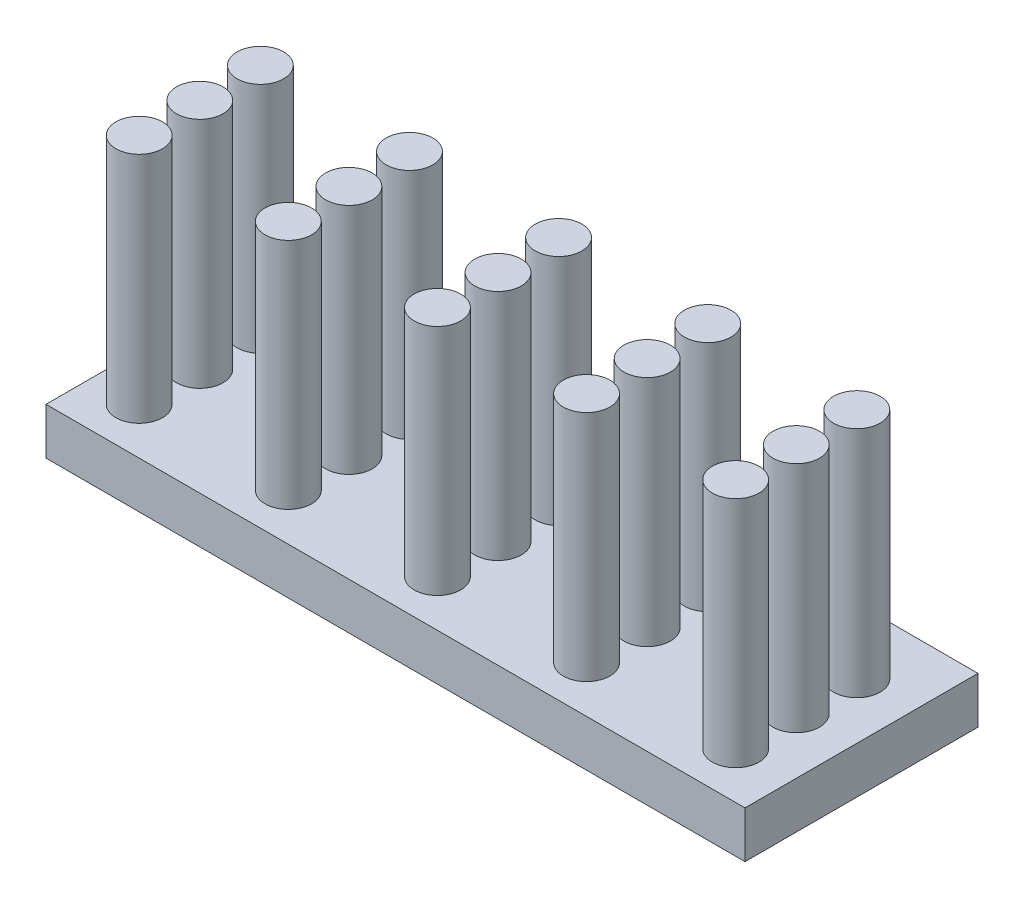
ISO-10303-21;
HEADER;
FILE_DESCRIPTION(('STEP AP214'),'2;1');
FILE_NAME('part.step','',(''),(''),'','','');
FILE_SCHEMA(('AUTOMOTIVE_DESIGN { 1 0 10303 214 1 1 1 1 }'));
ENDSEC;
DATA;
#1=APPLICATION_CONTEXT('core data for automotive mechanical design processes');
#2=APPLICATION_PROTOCOL_DEFINITION('international standard','automotive_design',2000,#1);
#3=PRODUCT_CONTEXT('',#1,'mechanical');
#4=PRODUCT('Part','Part','',(#3));
#5=PRODUCT_RELATED_PRODUCT_CATEGORY('part','',(#4));
#6=PRODUCT_DEFINITION_FORMATION('','',#4);
#7=PRODUCT_DEFINITION_CONTEXT('part definition',#1,'design');
#8=PRODUCT_DEFINITION('design','',#6,#7);
#9=PRODUCT_DEFINITION_SHAPE('','',#8);
#10=(LENGTH_UNIT() NAMED_UNIT(*) SI_UNIT(.MILLI.,.METRE.));
#11=(NAMED_UNIT(*) PLANE_ANGLE_UNIT() SI_UNIT($,.RADIAN.));
#12=(NAMED_UNIT(*) SI_UNIT($,.STERADIAN.) SOLID_ANGLE_UNIT());
#13=UNCERTAINTY_MEASURE_WITH_UNIT(LENGTH_MEASURE(1.E-05),#10,'distance_accuracy_value','');
#14=(GEOMETRIC_REPRESENTATION_CONTEXT(3) GLOBAL_UNCERTAINTY_ASSIGNED_CONTEXT((#13)) GLOBAL_UNIT_ASSIGNED_CONTEXT((#10,
#11,#12)) REPRESENTATION_CONTEXT('',''));
#15=CARTESIAN_POINT('',(0.,0.,0.));
#16=DIRECTION('',(0.,0.,1.));
#17=DIRECTION('',(1.,0.,0.));
#18=AXIS2_PLACEMENT_3D('',#15,#16,#17);
#19=CARTESIAN_POINT('',(63.,60.,-11.));
#20=DIRECTION('',(0.,1.,0.));
#21=DIRECTION('',(0.,0.,1.));
#22=AXIS2_PLACEMENT_3D('',#19,#20,#21);
#23=PLANE('',#22);
#24=CARTESIAN_POINT('',(63.,60.,-11.));
#25=DIRECTION('',(0.,1.,0.));
#26=DIRECTION('',(0.,0.,1.));
#27=AXIS2_PLACEMENT_3D('',#24,#25,#26);
#28=CIRCLE('',#27,5.);
#29=CARTESIAN_POINT('',(63.,60.,-6.));
#30=VERTEX_POINT('',#29);
#31=EDGE_CURVE('E11',#30,#30,#28,.T.);
#32=ORIENTED_EDGE('',*,*,#31,.T.);
#33=EDGE_LOOP('',(#32));
#34=FACE_BOUND('',#33,.T.);
#35=ADVANCED_FACE('F38',(#34),#23,.T.);
#36=CARTESIAN_POINT('',(63.,60.,-11.));
#37=DIRECTION('',(0.,-1.,0.));
#38=DIRECTION('',(0.,0.,-1.));
#39=AXIS2_PLACEMENT_3D('',#36,#37,#38);
#40=CYLINDRICAL_SURFACE('',#39,5.);
#41=ORIENTED_EDGE('',*,*,#31,.F.);
#42=EDGE_LOOP('',(#41));
#43=FACE_BOUND('',#42,.T.);
#44=CARTESIAN_POINT('',(63.,10.,-11.));
#45=DIRECTION('',(0.,1.,0.));
#46=DIRECTION('',(0.,0.,1.));
#47=AXIS2_PLACEMENT_3D('',#44,#45,#46);
#48=CIRCLE('',#47,5.);
#49=CARTESIAN_POINT('',(63.,10.,-6.));
#50=VERTEX_POINT('',#49);
#51=EDGE_CURVE('E47',#50,#50,#48,.T.);
#52=ORIENTED_EDGE('',*,*,#51,.T.);
#53=EDGE_LOOP('',(#52));
#54=FACE_BOUND('',#53,.T.);
#55=ADVANCED_FACE('F227',(#43,#54),#40,.T.);
#56=CARTESIAN_POINT('',(31.,60.,-11.));
#57=DIRECTION('',(0.,1.,0.));
#58=DIRECTION('',(0.,0.,1.));
#59=AXIS2_PLACEMENT_3D('',#56,#57,#58);
#60=PLANE('',#59);
#61=CARTESIAN_POINT('',(31.,60.,-11.));
#62=DIRECTION('',(0.,1.,0.));
#63=DIRECTION('',(0.,0.,1.));
#64=AXIS2_PLACEMENT_3D('',#61,#62,#63);
#65=CIRCLE('',#64,5.);
#66=CARTESIAN_POINT('',(31.,60.,-6.));
#67=VERTEX_POINT('',#66);
#68=EDGE_CURVE('E220',#67,#67,#65,.T.);
#69=ORIENTED_EDGE('',*,*,#68,.T.);
#70=EDGE_LOOP('',(#69));
#71=FACE_BOUND('',#70,.T.);
#72=ADVANCED_FACE('F253',(#71),#60,.T.);
#73=CARTESIAN_POINT('',(31.,60.,-11.));
#74=DIRECTION('',(0.,-1.,0.));
#75=DIRECTION('',(0.,0.,-1.));
#76=AXIS2_PLACEMENT_3D('',#73,#74,#75);
#77=CYLINDRICAL_SURFACE('',#76,5.);
#78=ORIENTED_EDGE('',*,*,#68,.F.);
#79=EDGE_LOOP('',(#78));
#80=FACE_BOUND('',#79,.T.);
#81=CARTESIAN_POINT('',(31.,10.,-11.));
#82=DIRECTION('',(0.,1.,0.));
#83=DIRECTION('',(0.,0.,1.));
#84=AXIS2_PLACEMENT_3D('',#81,#82,#83);
#85=CIRCLE('',#84,5.);
#86=CARTESIAN_POINT('',(31.,10.,-6.));
#87=VERTEX_POINT('',#86);
#88=EDGE_CURVE('E216',#87,#87,#85,.T.);
#89=ORIENTED_EDGE('',*,*,#88,.T.);
#90=EDGE_LOOP('',(#89));
#91=FACE_BOUND('',#90,.T.);
#92=ADVANCED_FACE('F259',(#80,#91),#77,.T.);
#93=CARTESIAN_POINT('',(-0.999999999999973,60.,-11.));
#94=DIRECTION('',(0.,1.,0.));
#95=DIRECTION('',(0.,0.,1.));
#96=AXIS2_PLACEMENT_3D('',#93,#94,#95);
#97=PLANE('',#96);
#98=CARTESIAN_POINT('',(-0.999999999999973,60.,-11.));
#99=DIRECTION('',(0.,1.,0.));
#100=DIRECTION('',(0.,0.,1.));
#101=AXIS2_PLACEMENT_3D('',#98,#99,#100);
#102=CIRCLE('',#101,5.);
#103=CARTESIAN_POINT('',(-0.999999999999973,60.,-6.));
#104=VERTEX_POINT('',#103);
#105=EDGE_CURVE('E212',#104,#104,#102,.T.);
#106=ORIENTED_EDGE('',*,*,#105,.T.);
#107=EDGE_LOOP('',(#106));
#108=FACE_BOUND('',#107,.T.);
#109=ADVANCED_FACE('F265',(#108),#97,.T.);
#110=CARTESIAN_POINT('',(-0.999999999999973,60.,-11.));
#111=DIRECTION('',(0.,-1.,0.));
#112=DIRECTION('',(0.,0.,-1.));
#113=AXIS2_PLACEMENT_3D('',#110,#111,#112);
#114=CYLINDRICAL_SURFACE('',#113,5.);
#115=ORIENTED_EDGE('',*,*,#105,.F.);
#116=EDGE_LOOP('',(#115));
#117=FACE_BOUND('',#116,.T.);
#118=CARTESIAN_POINT('',(-0.999999999999973,10.,-11.));
#119=DIRECTION('',(0.,1.,0.));
#120=DIRECTION('',(0.,0.,1.));
#121=AXIS2_PLACEMENT_3D('',#118,#119,#120);
#122=CIRCLE('',#121,5.);
#123=CARTESIAN_POINT('',(-0.999999999999973,10.,-6.));
#124=VERTEX_POINT('',#123);
#125=EDGE_CURVE('E208',#124,#124,#122,.T.);
#126=ORIENTED_EDGE('',*,*,#125,.T.);
#127=EDGE_LOOP('',(#126));
#128=FACE_BOUND('',#127,.T.);
#129=ADVANCED_FACE('F269',(#117,#128),#114,.T.);
#130=CARTESIAN_POINT('',(-33.,60.,-11.));
#131=DIRECTION('',(0.,1.,0.));
#132=DIRECTION('',(0.,0.,1.));
#133=AXIS2_PLACEMENT_3D('',#130,#131,#132);
#134=PLANE('',#133);
#135=CARTESIAN_POINT('',(-33.,60.,-11.));
#136=DIRECTION('',(0.,1.,0.));
#137=DIRECTION('',(0.,0.,1.));
#138=AXIS2_PLACEMENT_3D('',#135,#136,#137);
#139=CIRCLE('',#138,5.);
#140=CARTESIAN_POINT('',(-33.,60.,-6.));
#141=VERTEX_POINT('',#140);
#142=EDGE_CURVE('E204',#141,#141,#139,.T.);
#143=ORIENTED_EDGE('',*,*,#142,.T.);
#144=EDGE_LOOP('',(#143));
#145=FACE_BOUND('',#144,.T.);
#146=ADVANCED_FACE('F273',(#145),#134,.T.);
#147=CARTESIAN_POINT('',(-33.,60.,-11.));
#148=DIRECTION('',(0.,-1.,0.));
#149=DIRECTION('',(0.,0.,-1.));
#150=AXIS2_PLACEMENT_3D('',#147,#148,#149);
#151=CYLINDRICAL_SURFACE('',#150,5.);
#152=ORIENTED_EDGE('',*,*,#142,.F.);
#153=EDGE_LOOP('',(#152));
#154=FACE_BOUND('',#153,.T.);
#155=CARTESIAN_POINT('',(-33.,10.,-11.));
#156=DIRECTION('',(0.,1.,0.));
#157=DIRECTION('',(0.,0.,1.));
#158=AXIS2_PLACEMENT_3D('',#155,#156,#157);
#159=CIRCLE('',#158,5.);
#160=CARTESIAN_POINT('',(-33.,10.,-6.));
#161=VERTEX_POINT('',#160);
#162=EDGE_CURVE('E200',#161,#161,#159,.T.);
#163=ORIENTED_EDGE('',*,*,#162,.T.);
#164=EDGE_LOOP('',(#163));
#165=FACE_BOUND('',#164,.T.);
#166=ADVANCED_FACE('F277',(#154,#165),#151,.T.);
#167=CARTESIAN_POINT('',(-65.,60.,-11.));
#168=DIRECTION('',(0.,1.,0.));
#169=DIRECTION('',(0.,0.,1.));
#170=AXIS2_PLACEMENT_3D('',#167,#168,#169);
#171=PLANE('',#170);
#172=CARTESIAN_POINT('',(-65.,60.,-11.));
#173=DIRECTION('',(0.,1.,0.));
#174=DIRECTION('',(0.,0.,1.));
#175=AXIS2_PLACEMENT_3D('',#172,#173,#174);
#176=CIRCLE('',#175,5.);
#177=CARTESIAN_POINT('',(-65.,60.,-6.));
#178=VERTEX_POINT('',#177);
#179=EDGE_CURVE('E196',#178,#178,#176,.T.);
#180=ORIENTED_EDGE('',*,*,#179,.T.);
#181=EDGE_LOOP('',(#180));
#182=FACE_BOUND('',#181,.T.);
#183=ADVANCED_FACE('F281',(#182),#171,.T.);
#184=CARTESIAN_POINT('',(-65.,60.,-11.));
#185=DIRECTION('',(0.,-1.,0.));
#186=DIRECTION('',(0.,0.,-1.));
#187=AXIS2_PLACEMENT_3D('',#184,#185,#186);
#188=CYLINDRICAL_SURFACE('',#187,5.);
#189=ORIENTED_EDGE('',*,*,#179,.F.);
#190=EDGE_LOOP('',(#189));
#191=FACE_BOUND('',#190,.T.);
#192=CARTESIAN_POINT('',(-65.,10.,-11.));
#193=DIRECTION('',(0.,1.,0.));
#194=DIRECTION('',(0.,0.,1.));
#195=AXIS2_PLACEMENT_3D('',#192,#193,#194);
#196=CIRCLE('',#195,5.);
#197=CARTESIAN_POINT('',(-65.,10.,-6.));
#198=VERTEX_POINT('',#197);
#199=EDGE_CURVE('E192',#198,#198,#196,.T.);
#200=ORIENTED_EDGE('',*,*,#199,.T.);
#201=EDGE_LOOP('',(#200));
#202=FACE_BOUND('',#201,.T.);
#203=ADVANCED_FACE('F285',(#191,#202),#188,.T.);
#204=CARTESIAN_POINT('',(63.,60.,2.));
#205=DIRECTION('',(0.,1.,0.));
#206=DIRECTION('',(0.,0.,1.));
#207=AXIS2_PLACEMENT_3D('',#204,#205,#206);
#208=PLANE('',#207);
#209=CARTESIAN_POINT('',(63.,60.,2.));
#210=DIRECTION('',(0.,1.,0.));
#211=DIRECTION('',(0.,0.,1.));
#212=AXIS2_PLACEMENT_3D('',#209,#210,#211);
#213=CIRCLE('',#212,5.);
#214=CARTESIAN_POINT('',(63.,60.,7.));
#215=VERTEX_POINT('',#214);
#216=EDGE_CURVE('E188',#215,#215,#213,.T.);
#217=ORIENTED_EDGE('',*,*,#216,.T.);
#218=EDGE_LOOP('',(#217));
#219=FACE_BOUND('',#218,.T.);
#220=ADVANCED_FACE('F289',(#219),#208,.T.);
#221=CARTESIAN_POINT('',(63.,60.,2.));
#222=DIRECTION('',(0.,-1.,0.));
#223=DIRECTION('',(0.,0.,-1.));
#224=AXIS2_PLACEMENT_3D('',#221,#222,#223);
#225=CYLINDRICAL_SURFACE('',#224,5.);
#226=ORIENTED_EDGE('',*,*,#216,.F.);
#227=EDGE_LOOP('',(#226));
#228=FACE_BOUND('',#227,.T.);
#229=CARTESIAN_POINT('',(63.,10.,2.));
#230=DIRECTION('',(0.,1.,0.));
#231=DIRECTION('',(0.,0.,1.));
#232=AXIS2_PLACEMENT_3D('',#229,#230,#231);
#233=CIRCLE('',#232,5.);
#234=CARTESIAN_POINT('',(63.,10.,7.));
#235=VERTEX_POINT('',#234);
#236=EDGE_CURVE('E184',#235,#235,#233,.T.);
#237=ORIENTED_EDGE('',*,*,#236,.T.);
#238=EDGE_LOOP('',(#237));
#239=FACE_BOUND('',#238,.T.);
#240=ADVANCED_FACE('F293',(#228,#239),#225,.T.);
#241=CARTESIAN_POINT('',(31.,60.,2.));
#242=DIRECTION('',(0.,1.,0.));
#243=DIRECTION('',(0.,0.,1.));
#244=AXIS2_PLACEMENT_3D('',#241,#242,#243);
#245=PLANE('',#244);
#246=CARTESIAN_POINT('',(31.,60.,2.));
#247=DIRECTION('',(0.,1.,0.));
#248=DIRECTION('',(0.,0.,1.));
#249=AXIS2_PLACEMENT_3D('',#246,#247,#248);
#250=CIRCLE('',#249,5.);
#251=CARTESIAN_POINT('',(31.,60.,7.));
#252=VERTEX_POINT('',#251);
#253=EDGE_CURVE('E180',#252,#252,#250,.T.);
#254=ORIENTED_EDGE('',*,*,#253,.T.);
#255=EDGE_LOOP('',(#254));
#256=FACE_BOUND('',#255,.T.);
#257=ADVANCED_FACE('F297',(#256),#245,.T.);
#258=CARTESIAN_POINT('',(31.,60.,2.));
#259=DIRECTION('',(0.,-1.,0.));
#260=DIRECTION('',(0.,0.,-1.));
#261=AXIS2_PLACEMENT_3D('',#258,#259,#260);
#262=CYLINDRICAL_SURFACE('',#261,5.);
#263=ORIENTED_EDGE('',*,*,#253,.F.);
#264=EDGE_LOOP('',(#263));
#265=FACE_BOUND('',#264,.T.);
#266=CARTESIAN_POINT('',(31.,10.,2.));
#267=DIRECTION('',(0.,1.,0.));
#268=DIRECTION('',(0.,0.,1.));
#269=AXIS2_PLACEMENT_3D('',#266,#267,#268);
#270=CIRCLE('',#269,5.);
#271=CARTESIAN_POINT('',(31.,10.,7.));
#272=VERTEX_POINT('',#271);
#273=EDGE_CURVE('E176',#272,#272,#270,.T.);
#274=ORIENTED_EDGE('',*,*,#273,.T.);
#275=EDGE_LOOP('',(#274));
#276=FACE_BOUND('',#275,.T.);
#277=ADVANCED_FACE('F301',(#265,#276),#262,.T.);
#278=CARTESIAN_POINT('',(-0.999999999999973,60.,2.));
#279=DIRECTION('',(0.,1.,0.));
#280=DIRECTION('',(0.,0.,1.));
#281=AXIS2_PLACEMENT_3D('',#278,#279,#280);
#282=PLANE('',#281);
#283=CARTESIAN_POINT('',(-0.999999999999973,60.,2.));
#284=DIRECTION('',(0.,1.,0.));
#285=DIRECTION('',(0.,0.,1.));
#286=AXIS2_PLACEMENT_3D('',#283,#284,#285);
#287=CIRCLE('',#286,5.);
#288=CARTESIAN_POINT('',(-0.999999999999973,60.,7.));
#289=VERTEX_POINT('',#288);
#290=EDGE_CURVE('E172',#289,#289,#287,.T.);
#291=ORIENTED_EDGE('',*,*,#290,.T.);
#292=EDGE_LOOP('',(#291));
#293=FACE_BOUND('',#292,.T.);
#294=ADVANCED_FACE('F305',(#293),#282,.T.);
#295=CARTESIAN_POINT('',(-0.999999999999973,60.,2.));
#296=DIRECTION('',(0.,-1.,0.));
#297=DIRECTION('',(0.,0.,-1.));
#298=AXIS2_PLACEMENT_3D('',#295,#296,#297);
#299=CYLINDRICAL_SURFACE('',#298,5.);
#300=ORIENTED_EDGE('',*,*,#290,.F.);
#301=EDGE_LOOP('',(#300));
#302=FACE_BOUND('',#301,.T.);
#303=CARTESIAN_POINT('',(-0.999999999999973,10.,2.));
#304=DIRECTION('',(0.,1.,0.));
#305=DIRECTION('',(0.,0.,1.));
#306=AXIS2_PLACEMENT_3D('',#303,#304,#305);
#307=CIRCLE('',#306,5.);
#308=CARTESIAN_POINT('',(-0.999999999999973,10.,7.));
#309=VERTEX_POINT('',#308);
#310=EDGE_CURVE('E168',#309,#309,#307,.T.);
#311=ORIENTED_EDGE('',*,*,#310,.T.);
#312=EDGE_LOOP('',(#311));
#313=FACE_BOUND('',#312,.T.);
#314=ADVANCED_FACE('F309',(#302,#313),#299,.T.);
#315=CARTESIAN_POINT('',(-33.,60.,2.));
#316=DIRECTION('',(0.,1.,0.));
#317=DIRECTION('',(0.,0.,1.));
#318=AXIS2_PLACEMENT_3D('',#315,#316,#317);
#319=PLANE('',#318);
#320=CARTESIAN_POINT('',(-33.,60.,2.));
#321=DIRECTION('',(0.,1.,0.));
#322=DIRECTION('',(0.,0.,1.));
#323=AXIS2_PLACEMENT_3D('',#320,#321,#322);
#324=CIRCLE('',#323,5.);
#325=CARTESIAN_POINT('',(-33.,60.,7.));
#326=VERTEX_POINT('',#325);
#327=EDGE_CURVE('E164',#326,#326,#324,.T.);
#328=ORIENTED_EDGE('',*,*,#327,.T.);
#329=EDGE_LOOP('',(#328));
#330=FACE_BOUND('',#329,.T.);
#331=ADVANCED_FACE('F313',(#330),#319,.T.);
#332=CARTESIAN_POINT('',(-33.,60.,2.));
#333=DIRECTION('',(0.,-1.,0.));
#334=DIRECTION('',(0.,0.,-1.));
#335=AXIS2_PLACEMENT_3D('',#332,#333,#334);
#336=CYLINDRICAL_SURFACE('',#335,5.);
#337=ORIENTED_EDGE('',*,*,#327,.F.);
#338=EDGE_LOOP('',(#337));
#339=FACE_BOUND('',#338,.T.);
#340=CARTESIAN_POINT('',(-33.,10.,2.));
#341=DIRECTION('',(0.,1.,0.));
#342=DIRECTION('',(0.,0.,1.));
#343=AXIS2_PLACEMENT_3D('',#340,#341,#342);
#344=CIRCLE('',#343,5.);
#345=CARTESIAN_POINT('',(-33.,10.,7.));
#346=VERTEX_POINT('',#345);
#347=EDGE_CURVE('E160',#346,#346,#344,.T.);
#348=ORIENTED_EDGE('',*,*,#347,.T.);
#349=EDGE_LOOP('',(#348));
#350=FACE_BOUND('',#349,.T.);
#351=ADVANCED_FACE('F317',(#339,#350),#336,.T.);
#352=CARTESIAN_POINT('',(-65.,60.,2.));
#353=DIRECTION('',(0.,1.,0.));
#354=DIRECTION('',(0.,0.,1.));
#355=AXIS2_PLACEMENT_3D('',#352,#353,#354);
#356=PLANE('',#355);
#357=CARTESIAN_POINT('',(-65.,60.,2.));
#358=DIRECTION('',(0.,1.,0.));
#359=DIRECTION('',(0.,0.,1.));
#360=AXIS2_PLACEMENT_3D('',#357,#358,#359);
#361=CIRCLE('',#360,5.);
#362=CARTESIAN_POINT('',(-65.,60.,7.));
#363=VERTEX_POINT('',#362);
#364=EDGE_CURVE('E156',#363,#363,#361,.T.);
#365=ORIENTED_EDGE('',*,*,#364,.T.);
#366=EDGE_LOOP('',(#365));
#367=FACE_BOUND('',#366,.T.);
#368=ADVANCED_FACE('F321',(#367),#356,.T.);
#369=CARTESIAN_POINT('',(-65.,60.,2.));
#370=DIRECTION('',(0.,-1.,0.));
#371=DIRECTION('',(0.,0.,-1.));
#372=AXIS2_PLACEMENT_3D('',#369,#370,#371);
#373=CYLINDRICAL_SURFACE('',#372,5.);
#374=ORIENTED_EDGE('',*,*,#364,.F.);
#375=EDGE_LOOP('',(#374));
#376=FACE_BOUND('',#375,.T.);
#377=CARTESIAN_POINT('',(-65.,10.,2.));
#378=DIRECTION('',(0.,1.,0.));
#379=DIRECTION('',(0.,0.,1.));
#380=AXIS2_PLACEMENT_3D('',#377,#378,#379);
#381=CIRCLE('',#380,5.);
#382=CARTESIAN_POINT('',(-65.,10.,7.));
#383=VERTEX_POINT('',#382);
#384=EDGE_CURVE('E152',#383,#383,#381,.T.);
#385=ORIENTED_EDGE('',*,*,#384,.T.);
#386=EDGE_LOOP('',(#385));
#387=FACE_BOUND('',#386,.T.);
#388=ADVANCED_FACE('F325',(#376,#387),#373,.T.);
#389=CARTESIAN_POINT('',(63.,60.,15.));
#390=DIRECTION('',(0.,1.,0.));
#391=DIRECTION('',(0.,0.,1.));
#392=AXIS2_PLACEMENT_3D('',#389,#390,#391);
#393=PLANE('',#392);
#394=CARTESIAN_POINT('',(63.,60.,15.));
#395=DIRECTION('',(0.,1.,0.));
#396=DIRECTION('',(0.,0.,1.));
#397=AXIS2_PLACEMENT_3D('',#394,#395,#396);
#398=CIRCLE('',#397,5.);
#399=CARTESIAN_POINT('',(63.,60.,20.));
#400=VERTEX_POINT('',#399);
#401=EDGE_CURVE('E148',#400,#400,#398,.T.);
#402=ORIENTED_EDGE('',*,*,#401,.T.);
#403=EDGE_LOOP('',(#402));
#404=FACE_BOUND('',#403,.T.);
#405=ADVANCED_FACE('F329',(#404),#393,.T.);
#406=CARTESIAN_POINT('',(63.,60.,15.));
#407=DIRECTION('',(0.,-1.,0.));
#408=DIRECTION('',(0.,0.,-1.));
#409=AXIS2_PLACEMENT_3D('',#406,#407,#408);
#410=CYLINDRICAL_SURFACE('',#409,5.);
#411=ORIENTED_EDGE('',*,*,#401,.F.);
#412=EDGE_LOOP('',(#411));
#413=FACE_BOUND('',#412,.T.);
#414=CARTESIAN_POINT('',(63.,10.,15.));
#415=DIRECTION('',(0.,1.,0.));
#416=DIRECTION('',(0.,0.,1.));
#417=AXIS2_PLACEMENT_3D('',#414,#415,#416);
#418=CIRCLE('',#417,5.);
#419=CARTESIAN_POINT('',(63.,10.,20.));
#420=VERTEX_POINT('',#419);
#421=EDGE_CURVE('E144',#420,#420,#418,.T.);
#422=ORIENTED_EDGE('',*,*,#421,.T.);
#423=EDGE_LOOP('',(#422));
#424=FACE_BOUND('',#423,.T.);
#425=ADVANCED_FACE('F333',(#413,#424),#410,.T.);
#426=CARTESIAN_POINT('',(31.,60.,15.));
#427=DIRECTION('',(0.,1.,0.));
#428=DIRECTION('',(0.,0.,1.));
#429=AXIS2_PLACEMENT_3D('',#426,#427,#428);
#430=PLANE('',#429);
#431=CARTESIAN_POINT('',(31.,60.,15.));
#432=DIRECTION('',(0.,1.,0.));
#433=DIRECTION('',(0.,0.,1.));
#434=AXIS2_PLACEMENT_3D('',#431,#432,#433);
#435=CIRCLE('',#434,5.);
#436=CARTESIAN_POINT('',(31.,60.,20.));
#437=VERTEX_POINT('',#436);
#438=EDGE_CURVE('E140',#437,#437,#435,.T.);
#439=ORIENTED_EDGE('',*,*,#438,.T.);
#440=EDGE_LOOP('',(#439));
#441=FACE_BOUND('',#440,.T.);
#442=ADVANCED_FACE('F337',(#441),#430,.T.);
#443=CARTESIAN_POINT('',(31.,60.,15.));
#444=DIRECTION('',(0.,-1.,0.));
#445=DIRECTION('',(0.,0.,-1.));
#446=AXIS2_PLACEMENT_3D('',#443,#444,#445);
#447=CYLINDRICAL_SURFACE('',#446,5.);
#448=ORIENTED_EDGE('',*,*,#438,.F.);
#449=EDGE_LOOP('',(#448));
#450=FACE_BOUND('',#449,.T.);
#451=CARTESIAN_POINT('',(31.,10.,15.));
#452=DIRECTION('',(0.,1.,0.));
#453=DIRECTION('',(0.,0.,1.));
#454=AXIS2_PLACEMENT_3D('',#451,#452,#453);
#455=CIRCLE('',#454,5.);
#456=CARTESIAN_POINT('',(31.,10.,20.));
#457=VERTEX_POINT('',#456);
#458=EDGE_CURVE('E136',#457,#457,#455,.T.);
#459=ORIENTED_EDGE('',*,*,#458,.T.);
#460=EDGE_LOOP('',(#459));
#461=FACE_BOUND('',#460,.T.);
#462=ADVANCED_FACE('F341',(#450,#461),#447,.T.);
#463=CARTESIAN_POINT('',(-0.999999999999973,60.,15.));
#464=DIRECTION('',(0.,1.,0.));
#465=DIRECTION('',(0.,0.,1.));
#466=AXIS2_PLACEMENT_3D('',#463,#464,#465);
#467=PLANE('',#466);
#468=CARTESIAN_POINT('',(-0.999999999999973,60.,15.));
#469=DIRECTION('',(0.,1.,0.));
#470=DIRECTION('',(0.,0.,1.));
#471=AXIS2_PLACEMENT_3D('',#468,#469,#470);
#472=CIRCLE('',#471,5.);
#473=CARTESIAN_POINT('',(-0.999999999999973,60.,20.));
#474=VERTEX_POINT('',#473);
#475=EDGE_CURVE('E132',#474,#474,#472,.T.);
#476=ORIENTED_EDGE('',*,*,#475,.T.);
#477=EDGE_LOOP('',(#476));
#478=FACE_BOUND('',#477,.T.);
#479=ADVANCED_FACE('F345',(#478),#467,.T.);
#480=CARTESIAN_POINT('',(-0.999999999999973,60.,15.));
#481=DIRECTION('',(0.,-1.,0.));
#482=DIRECTION('',(0.,0.,-1.));
#483=AXIS2_PLACEMENT_3D('',#480,#481,#482);
#484=CYLINDRICAL_SURFACE('',#483,5.);
#485=ORIENTED_EDGE('',*,*,#475,.F.);
#486=EDGE_LOOP('',(#485));
#487=FACE_BOUND('',#486,.T.);
#488=CARTESIAN_POINT('',(-0.999999999999973,10.,15.));
#489=DIRECTION('',(0.,1.,0.));
#490=DIRECTION('',(0.,0.,1.));
#491=AXIS2_PLACEMENT_3D('',#488,#489,#490);
#492=CIRCLE('',#491,5.);
#493=CARTESIAN_POINT('',(-0.999999999999973,10.,20.));
#494=VERTEX_POINT('',#493);
#495=EDGE_CURVE('E128',#494,#494,#492,.T.);
#496=ORIENTED_EDGE('',*,*,#495,.T.);
#497=EDGE_LOOP('',(#496));
#498=FACE_BOUND('',#497,.T.);
#499=ADVANCED_FACE('F349',(#487,#498),#484,.T.);
#500=CARTESIAN_POINT('',(75.,10.,-25.));
#501=DIRECTION('',(-1.,0.,0.));
#502=DIRECTION('',(0.,0.,1.));
#503=AXIS2_PLACEMENT_3D('',#500,#501,#502);
#504=PLANE('',#503);
#505=DIRECTION('',(0.,0.,-1.));
#506=VECTOR('',#505,1.);
#507=CARTESIAN_POINT('',(75.,0.,-25.));
#508=LINE('',#507,#506);
#509=CARTESIAN_POINT('',(75.,0.,25.));
#510=VERTEX_POINT('',#509);
#511=CARTESIAN_POINT('',(75.,0.,-25.));
#512=VERTEX_POINT('',#511);
#513=EDGE_CURVE('E111',#510,#512,#508,.T.);
#514=ORIENTED_EDGE('',*,*,#513,.T.);
#515=DIRECTION('',(0.,-1.,0.));
#516=VECTOR('',#515,1.);
#517=CARTESIAN_POINT('',(75.,10.,-25.));
#518=LINE('',#517,#516);
#519=CARTESIAN_POINT('',(75.,10.,-25.));
#520=VERTEX_POINT('',#519);
#521=EDGE_CURVE('E100',#520,#512,#518,.T.);
#522=ORIENTED_EDGE('',*,*,#521,.F.);
#523=DIRECTION('',(0.,0.,-1.));
#524=VECTOR('',#523,1.);
#525=CARTESIAN_POINT('',(75.,10.,-25.));
#526=LINE('',#525,#524);
#527=CARTESIAN_POINT('',(75.,10.,25.));
#528=VERTEX_POINT('',#527);
#529=EDGE_CURVE('E92',#528,#520,#526,.T.);
#530=ORIENTED_EDGE('',*,*,#529,.F.);
#531=DIRECTION('',(0.,-1.,0.));
#532=VECTOR('',#531,1.);
#533=CARTESIAN_POINT('',(75.,10.,25.));
#534=LINE('',#533,#532);
#535=EDGE_CURVE('E107',#528,#510,#534,.T.);
#536=ORIENTED_EDGE('',*,*,#535,.T.);
#537=EDGE_LOOP('',(#514,#522,#530,#536));
#538=FACE_BOUND('',#537,.T.);
#539=ADVANCED_FACE('F352',(#538),#504,.F.);
#540=CARTESIAN_POINT('',(-75.,10.,-25.));
#541=DIRECTION('',(0.,0.,1.));
#542=DIRECTION('',(1.,0.,0.));
#543=AXIS2_PLACEMENT_3D('',#540,#541,#542);
#544=PLANE('',#543);
#545=DIRECTION('',(-1.,0.,0.));
#546=VECTOR('',#545,1.);
#547=CARTESIAN_POINT('',(-75.,0.,-25.));
#548=LINE('',#547,#546);
#549=CARTESIAN_POINT('',(-75.,0.,-25.));
#550=VERTEX_POINT('',#549);
#551=EDGE_CURVE('E98',#512,#550,#548,.T.);
#552=ORIENTED_EDGE('',*,*,#551,.T.);
#553=DIRECTION('',(0.,-1.,0.));
#554=VECTOR('',#553,1.);
#555=CARTESIAN_POINT('',(-75.,10.,-25.));
#556=LINE('',#555,#554);
#557=CARTESIAN_POINT('',(-75.,10.,-25.));
#558=VERTEX_POINT('',#557);
#559=EDGE_CURVE('E96',#558,#550,#556,.T.);
#560=ORIENTED_EDGE('',*,*,#559,.F.);
#561=DIRECTION('',(-1.,0.,0.));
#562=VECTOR('',#561,1.);
#563=CARTESIAN_POINT('',(-75.,10.,-25.));
#564=LINE('',#563,#562);
#565=EDGE_CURVE('E86',#520,#558,#564,.T.);
#566=ORIENTED_EDGE('',*,*,#565,.F.);
#567=ORIENTED_EDGE('',*,*,#521,.T.);
#568=EDGE_LOOP('',(#552,#560,#566,#567));
#569=FACE_BOUND('',#568,.T.);
#570=ADVANCED_FACE('F97',(#569),#544,.F.);
#571=CARTESIAN_POINT('',(-75.,10.,-25.));
#572=DIRECTION('',(1.,0.,0.));
#573=DIRECTION('',(0.,0.,-1.));
#574=AXIS2_PLACEMENT_3D('',#571,#572,#573);
#575=PLANE('',#574);
#576=DIRECTION('',(0.,0.,1.));
#577=VECTOR('',#576,1.);
#578=CARTESIAN_POINT('',(-75.,0.,-25.));
#579=LINE('',#578,#577);
#580=CARTESIAN_POINT('',(-75.,0.,25.));
#581=VERTEX_POINT('',#580);
#582=EDGE_CURVE('E72',#550,#581,#579,.T.);
#583=ORIENTED_EDGE('',*,*,#582,.T.);
#584=DIRECTION('',(0.,-1.,0.));
#585=VECTOR('',#584,1.);
#586=CARTESIAN_POINT('',(-75.,10.,25.));
#587=LINE('',#586,#585);
#588=CARTESIAN_POINT('',(-75.,10.,25.));
#589=VERTEX_POINT('',#588);
#590=EDGE_CURVE('E101',#589,#581,#587,.T.);
#591=ORIENTED_EDGE('',*,*,#590,.F.);
#592=DIRECTION('',(0.,0.,1.));
#593=VECTOR('',#592,1.);
#594=CARTESIAN_POINT('',(-75.,10.,-25.));
#595=LINE('',#594,#593);
#596=EDGE_CURVE('E90',#558,#589,#595,.T.);
#597=ORIENTED_EDGE('',*,*,#596,.F.);
#598=ORIENTED_EDGE('',*,*,#559,.T.);
#599=EDGE_LOOP('',(#583,#591,#597,#598));
#600=FACE_BOUND('',#599,.T.);
#601=ADVANCED_FACE('F103',(#600),#575,.F.);
#602=CARTESIAN_POINT('',(-75.,10.,25.));
#603=DIRECTION('',(0.,0.,-1.));
#604=DIRECTION('',(-1.,0.,0.));
#605=AXIS2_PLACEMENT_3D('',#602,#603,#604);
#606=PLANE('',#605);
#607=DIRECTION('',(1.,0.,0.));
#608=VECTOR('',#607,1.);
#609=CARTESIAN_POINT('',(-75.,0.,25.));
#610=LINE('',#609,#608);
#611=EDGE_CURVE('E78',#581,#510,#610,.T.);
#612=ORIENTED_EDGE('',*,*,#611,.T.);
#613=ORIENTED_EDGE('',*,*,#535,.F.);
#614=DIRECTION('',(1.,0.,0.));
#615=VECTOR('',#614,1.);
#616=CARTESIAN_POINT('',(-75.,10.,25.));
#617=LINE('',#616,#615);
#618=EDGE_CURVE('E55',#589,#528,#617,.T.);
#619=ORIENTED_EDGE('',*,*,#618,.F.);
#620=ORIENTED_EDGE('',*,*,#590,.T.);
#621=EDGE_LOOP('',(#612,#613,#619,#620));
#622=FACE_BOUND('',#621,.T.);
#623=ADVANCED_FACE('F231',(#622),#606,.F.);
#624=CARTESIAN_POINT('',(0.,10.,0.));
#625=DIRECTION('',(0.,1.,0.));
#626=DIRECTION('',(0.,0.,1.));
#627=AXIS2_PLACEMENT_3D('',#624,#625,#626);
#628=PLANE('',#627);
#629=CARTESIAN_POINT('',(-33.,10.,15.));
#630=DIRECTION('',(0.,1.,0.));
#631=DIRECTION('',(0.,0.,1.));
#632=AXIS2_PLACEMENT_3D('',#629,#630,#631);
#633=CIRCLE('',#632,5.);
#634=CARTESIAN_POINT('',(-33.,10.,20.));
#635=VERTEX_POINT('',#634);
#636=EDGE_CURVE('E573',#635,#635,#633,.T.);
#637=ORIENTED_EDGE('',*,*,#636,.F.);
#638=EDGE_LOOP('',(#637));
#639=FACE_BOUND('',#638,.T.);
#640=CARTESIAN_POINT('',(-65.,10.,15.));
#641=DIRECTION('',(0.,1.,0.));
#642=DIRECTION('',(0.,0.,1.));
#643=AXIS2_PLACEMENT_3D('',#640,#641,#642);
#644=CIRCLE('',#643,5.);
#645=CARTESIAN_POINT('',(-65.,10.,20.));
#646=VERTEX_POINT('',#645);
#647=EDGE_CURVE('E572',#646,#646,#644,.T.);
#648=ORIENTED_EDGE('',*,*,#647,.F.);
#649=EDGE_LOOP('',(#648));
#650=FACE_BOUND('',#649,.T.);
#651=ORIENTED_EDGE('',*,*,#529,.T.);
#652=ORIENTED_EDGE('',*,*,#565,.T.);
#653=ORIENTED_EDGE('',*,*,#596,.T.);
#654=ORIENTED_EDGE('',*,*,#618,.T.);
#655=EDGE_LOOP('',(#651,#652,#653,#654));
#656=FACE_BOUND('',#655,.T.);
#657=ORIENTED_EDGE('',*,*,#495,.F.);
#658=EDGE_LOOP('',(#657));
#659=FACE_BOUND('',#658,.T.);
#660=ORIENTED_EDGE('',*,*,#458,.F.);
#661=EDGE_LOOP('',(#660));
#662=FACE_BOUND('',#661,.T.);
#663=ORIENTED_EDGE('',*,*,#421,.F.);
#664=EDGE_LOOP('',(#663));
#665=FACE_BOUND('',#664,.T.);
#666=ORIENTED_EDGE('',*,*,#384,.F.);
#667=EDGE_LOOP('',(#666));
#668=FACE_BOUND('',#667,.T.);
#669=ORIENTED_EDGE('',*,*,#347,.F.);
#670=EDGE_LOOP('',(#669));
#671=FACE_BOUND('',#670,.T.);
#672=ORIENTED_EDGE('',*,*,#310,.F.);
#673=EDGE_LOOP('',(#672));
#674=FACE_BOUND('',#673,.T.);
#675=ORIENTED_EDGE('',*,*,#273,.F.);
#676=EDGE_LOOP('',(#675));
#677=FACE_BOUND('',#676,.T.);
#678=ORIENTED_EDGE('',*,*,#236,.F.);
#679=EDGE_LOOP('',(#678));
#680=FACE_BOUND('',#679,.T.);
#681=ORIENTED_EDGE('',*,*,#199,.F.);
#682=EDGE_LOOP('',(#681));
#683=FACE_BOUND('',#682,.T.);
#684=ORIENTED_EDGE('',*,*,#162,.F.);
#685=EDGE_LOOP('',(#684));
#686=FACE_BOUND('',#685,.T.);
#687=ORIENTED_EDGE('',*,*,#125,.F.);
#688=EDGE_LOOP('',(#687));
#689=FACE_BOUND('',#688,.T.);
#690=ORIENTED_EDGE('',*,*,#88,.F.);
#691=EDGE_LOOP('',(#690));
#692=FACE_BOUND('',#691,.T.);
#693=ORIENTED_EDGE('',*,*,#51,.F.);
#694=EDGE_LOOP('',(#693));
#695=FACE_BOUND('',#694,.T.);
#696=ADVANCED_FACE('F87',(#639,#650,#656,#659,#662,#665,#668,#671,#674,#677,#680,#683,#686,#689,
#692,#695),#628,.T.);
#697=CARTESIAN_POINT('',(0.,0.,0.));
#698=DIRECTION('',(0.,1.,0.));
#699=DIRECTION('',(0.,0.,1.));
#700=AXIS2_PLACEMENT_3D('',#697,#698,#699);
#701=PLANE('',#700);
#702=ORIENTED_EDGE('',*,*,#513,.F.);
#703=ORIENTED_EDGE('',*,*,#611,.F.);
#704=ORIENTED_EDGE('',*,*,#582,.F.);
#705=ORIENTED_EDGE('',*,*,#551,.F.);
#706=EDGE_LOOP('',(#702,#703,#704,#705));
#707=FACE_BOUND('',#706,.T.);
#708=ADVANCED_FACE('F230',(#707),#701,.F.);
#709=CARTESIAN_POINT('',(-65.,60.,15.));
#710=DIRECTION('',(0.,-1.,0.));
#711=DIRECTION('',(0.,0.,-1.));
#712=AXIS2_PLACEMENT_3D('',#709,#710,#711);
#713=CYLINDRICAL_SURFACE('',#712,5.);
#714=CARTESIAN_POINT('',(-65.,60.,15.));
#715=DIRECTION('',(0.,1.,0.));
#716=DIRECTION('',(0.,0.,1.));
#717=AXIS2_PLACEMENT_3D('',#714,#715,#716);
#718=CIRCLE('',#717,5.);
#719=CARTESIAN_POINT('',(-65.,60.,20.));
#720=VERTEX_POINT('',#719);
#721=EDGE_CURVE('E115',#720,#720,#718,.T.);
#722=ORIENTED_EDGE('',*,*,#721,.F.);
#723=EDGE_LOOP('',(#722));
#724=FACE_BOUND('',#723,.T.);
#725=ORIENTED_EDGE('',*,*,#647,.T.);
#726=EDGE_LOOP('',(#725));
#727=FACE_BOUND('',#726,.T.);
#728=ADVANCED_FACE('F239',(#724,#727),#713,.T.);
#729=CARTESIAN_POINT('',(-65.,60.,15.));
#730=DIRECTION('',(0.,1.,0.));
#731=DIRECTION('',(0.,0.,1.));
#732=AXIS2_PLACEMENT_3D('',#729,#730,#731);
#733=PLANE('',#732);
#734=ORIENTED_EDGE('',*,*,#721,.T.);
#735=EDGE_LOOP('',(#734));
#736=FACE_BOUND('',#735,.T.);
#737=ADVANCED_FACE('F382',(#736),#733,.T.);
#738=CARTESIAN_POINT('',(-33.,60.,15.));
#739=DIRECTION('',(0.,-1.,0.));
#740=DIRECTION('',(0.,0.,-1.));
#741=AXIS2_PLACEMENT_3D('',#738,#739,#740);
#742=CYLINDRICAL_SURFACE('',#741,5.);
#743=CARTESIAN_POINT('',(-33.,60.,15.));
#744=DIRECTION('',(0.,1.,0.));
#745=DIRECTION('',(0.,0.,1.));
#746=AXIS2_PLACEMENT_3D('',#743,#744,#745);
#747=CIRCLE('',#746,5.);
#748=CARTESIAN_POINT('',(-33.,60.,20.));
#749=VERTEX_POINT('',#748);
#750=EDGE_CURVE('E570',#749,#749,#747,.T.);
#751=ORIENTED_EDGE('',*,*,#750,.F.);
#752=EDGE_LOOP('',(#751));
#753=FACE_BOUND('',#752,.T.);
#754=ORIENTED_EDGE('',*,*,#636,.T.);
#755=EDGE_LOOP('',(#754));
#756=FACE_BOUND('',#755,.T.);
#757=ADVANCED_FACE('F388',(#753,#756),#742,.T.);
#758=CARTESIAN_POINT('',(-33.,60.,15.));
#759=DIRECTION('',(0.,1.,0.));
#760=DIRECTION('',(0.,0.,1.));
#761=AXIS2_PLACEMENT_3D('',#758,#759,#760);
#762=PLANE('',#761);
#763=ORIENTED_EDGE('',*,*,#750,.T.);
#764=EDGE_LOOP('',(#763));
#765=FACE_BOUND('',#764,.T.);
#766=ADVANCED_FACE('F396',(#765),#762,.T.);
#767=CLOSED_SHELL('',(#35,#55,#72,#92,#109,#129,#146,#166,#183,#203,#220,#240,#257,#277,#294,
#314,#331,#351,#368,#388,#405,#425,#442,#462,#479,#499,#539,#570,#601,#623,#696,#708,#728,#737,
#757,#766));
#768=MANIFOLD_SOLID_BREP('B2',#767);
#769=ADVANCED_BREP_SHAPE_REPRESENTATION('',(#18,#768),#14);
#770=SHAPE_DEFINITION_REPRESENTATION(#9,#769);
ENDSEC;
END-ISO-10303-21;
